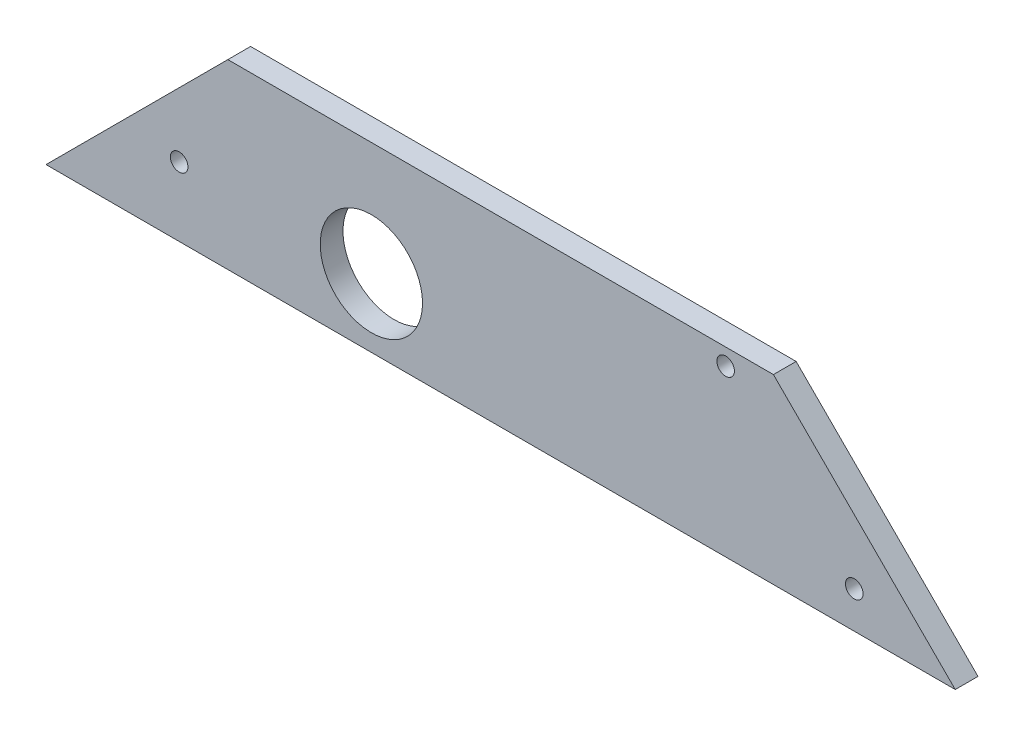
ISO-10303-21;
HEADER;
FILE_DESCRIPTION(('STEP AP214'),'2;1');
FILE_NAME('part.step','',(''),(''),'','','');
FILE_SCHEMA(('AUTOMOTIVE_DESIGN { 1 0 10303 214 1 1 1 1 }'));
ENDSEC;
DATA;
#1=APPLICATION_CONTEXT('core data for automotive mechanical design processes');
#2=APPLICATION_PROTOCOL_DEFINITION('international standard','automotive_design',2000,#1);
#3=PRODUCT_CONTEXT('',#1,'mechanical');
#4=PRODUCT('Part','Part','',(#3));
#5=PRODUCT_RELATED_PRODUCT_CATEGORY('part','',(#4));
#6=PRODUCT_DEFINITION_FORMATION('','',#4);
#7=PRODUCT_DEFINITION_CONTEXT('part definition',#1,'design');
#8=PRODUCT_DEFINITION('design','',#6,#7);
#9=PRODUCT_DEFINITION_SHAPE('','',#8);
#10=(LENGTH_UNIT() NAMED_UNIT(*) SI_UNIT(.MILLI.,.METRE.));
#11=(NAMED_UNIT(*) PLANE_ANGLE_UNIT() SI_UNIT($,.RADIAN.));
#12=(NAMED_UNIT(*) SI_UNIT($,.STERADIAN.) SOLID_ANGLE_UNIT());
#13=UNCERTAINTY_MEASURE_WITH_UNIT(LENGTH_MEASURE(1.E-05),#10,'distance_accuracy_value','');
#14=(GEOMETRIC_REPRESENTATION_CONTEXT(3) GLOBAL_UNCERTAINTY_ASSIGNED_CONTEXT((#13)) GLOBAL_UNIT_ASSIGNED_CONTEXT((#10,
#11,#12)) REPRESENTATION_CONTEXT('',''));
#15=CARTESIAN_POINT('',(0.,0.,0.));
#16=DIRECTION('',(0.,0.,1.));
#17=DIRECTION('',(1.,0.,0.));
#18=AXIS2_PLACEMENT_3D('',#15,#16,#17);
#19=CARTESIAN_POINT('',(-76.1999999999995,29.1621533831808,3.175));
#20=DIRECTION('',(0.,-1.,0.));
#21=DIRECTION('',(1.,0.,0.));
#22=AXIS2_PLACEMENT_3D('',#19,#20,#21);
#23=PLANE('',#22);
#24=DIRECTION('',(-1.,0.,0.));
#25=VECTOR('',#24,1.);
#26=CARTESIAN_POINT('',(-76.1999999999995,29.1621533831808,-3.175));
#27=LINE('',#26,#25);
#28=CARTESIAN_POINT('',(76.1999999999994,29.1621533831808,-3.175));
#29=VERTEX_POINT('',#28);
#30=CARTESIAN_POINT('',(-76.1999999999995,29.1621533831808,-3.175));
#31=VERTEX_POINT('',#30);
#32=EDGE_CURVE('E95',#29,#31,#27,.T.);
#33=ORIENTED_EDGE('',*,*,#32,.T.);
#34=DIRECTION('',(0.,0.,-1.));
#35=VECTOR('',#34,1.);
#36=CARTESIAN_POINT('',(-76.1999999999995,29.1621533831808,3.175));
#37=LINE('',#36,#35);
#38=CARTESIAN_POINT('',(-76.1999999999995,29.1621533831808,3.175));
#39=VERTEX_POINT('',#38);
#40=EDGE_CURVE('E11',#39,#31,#37,.T.);
#41=ORIENTED_EDGE('',*,*,#40,.F.);
#42=DIRECTION('',(-1.,0.,0.));
#43=VECTOR('',#42,1.);
#44=CARTESIAN_POINT('',(-76.1999999999995,29.1621533831808,3.175));
#45=LINE('',#44,#43);
#46=CARTESIAN_POINT('',(76.1999999999994,29.1621533831808,3.175));
#47=VERTEX_POINT('',#46);
#48=EDGE_CURVE('E83',#47,#39,#45,.T.);
#49=ORIENTED_EDGE('',*,*,#48,.F.);
#50=DIRECTION('',(0.,0.,-1.));
#51=VECTOR('',#50,1.);
#52=CARTESIAN_POINT('',(76.1999999999994,29.1621533831808,3.175));
#53=LINE('',#52,#51);
#54=EDGE_CURVE('E91',#47,#29,#53,.T.);
#55=ORIENTED_EDGE('',*,*,#54,.T.);
#56=EDGE_LOOP('',(#33,#41,#49,#55));
#57=FACE_BOUND('',#56,.T.);
#58=ADVANCED_FACE('F32',(#57),#23,.F.);
#59=CARTESIAN_POINT('',(-76.1999999999995,29.1621533831808,3.175));
#60=DIRECTION('',(0.707106781186544,-0.707106781186551,0.));
#61=DIRECTION('',(0.707106781186551,0.707106781186544,0.));
#62=AXIS2_PLACEMENT_3D('',#59,#60,#61);
#63=PLANE('',#62);
#64=DIRECTION('',(-0.707106781186551,-0.707106781186544,0.));
#65=VECTOR('',#64,1.);
#66=CARTESIAN_POINT('',(-76.1999999999995,29.1621533831808,-3.175));
#67=LINE('',#66,#65);
#68=CARTESIAN_POINT('',(-127.,-21.6378466168192,-3.175));
#69=VERTEX_POINT('',#68);
#70=EDGE_CURVE('E87',#31,#69,#67,.T.);
#71=ORIENTED_EDGE('',*,*,#70,.T.);
#72=DIRECTION('',(0.,0.,-1.));
#73=VECTOR('',#72,1.);
#74=CARTESIAN_POINT('',(-127.,-21.6378466168192,3.175));
#75=LINE('',#74,#73);
#76=CARTESIAN_POINT('',(-127.,-21.6378466168192,3.175));
#77=VERTEX_POINT('',#76);
#78=EDGE_CURVE('E40',#77,#69,#75,.T.);
#79=ORIENTED_EDGE('',*,*,#78,.F.);
#80=DIRECTION('',(-0.707106781186551,-0.707106781186544,0.));
#81=VECTOR('',#80,1.);
#82=CARTESIAN_POINT('',(-76.1999999999995,29.1621533831808,3.175));
#83=LINE('',#82,#81);
#84=EDGE_CURVE('E78',#39,#77,#83,.T.);
#85=ORIENTED_EDGE('',*,*,#84,.F.);
#86=ORIENTED_EDGE('',*,*,#40,.T.);
#87=EDGE_LOOP('',(#71,#79,#85,#86));
#88=FACE_BOUND('',#87,.T.);
#89=ADVANCED_FACE('F86',(#88),#63,.F.);
#90=CARTESIAN_POINT('',(-127.,-21.6378466168192,3.175));
#91=DIRECTION('',(0.,1.,0.));
#92=DIRECTION('',(0.,0.,1.));
#93=AXIS2_PLACEMENT_3D('',#90,#91,#92);
#94=PLANE('',#93);
#95=DIRECTION('',(1.,0.,0.));
#96=VECTOR('',#95,1.);
#97=CARTESIAN_POINT('',(-127.,-21.6378466168192,-3.175));
#98=LINE('',#97,#96);
#99=CARTESIAN_POINT('',(127.,-21.6378466168192,-3.175));
#100=VERTEX_POINT('',#99);
#101=EDGE_CURVE('E65',#69,#100,#98,.T.);
#102=ORIENTED_EDGE('',*,*,#101,.T.);
#103=DIRECTION('',(0.,0.,-1.));
#104=VECTOR('',#103,1.);
#105=CARTESIAN_POINT('',(127.,-21.6378466168192,3.175));
#106=LINE('',#105,#104);
#107=CARTESIAN_POINT('',(127.,-21.6378466168192,3.175));
#108=VERTEX_POINT('',#107);
#109=EDGE_CURVE('E88',#108,#100,#106,.T.);
#110=ORIENTED_EDGE('',*,*,#109,.F.);
#111=DIRECTION('',(1.,0.,0.));
#112=VECTOR('',#111,1.);
#113=CARTESIAN_POINT('',(-127.,-21.6378466168192,3.175));
#114=LINE('',#113,#112);
#115=EDGE_CURVE('E81',#77,#108,#114,.T.);
#116=ORIENTED_EDGE('',*,*,#115,.F.);
#117=ORIENTED_EDGE('',*,*,#78,.T.);
#118=EDGE_LOOP('',(#102,#110,#116,#117));
#119=FACE_BOUND('',#118,.T.);
#120=ADVANCED_FACE('F89',(#119),#94,.F.);
#121=CARTESIAN_POINT('',(127.,-21.6378466168192,3.175));
#122=DIRECTION('',(-0.707106781186543,-0.707106781186551,0.));
#123=DIRECTION('',(0.707106781186551,-0.707106781186544,0.));
#124=AXIS2_PLACEMENT_3D('',#121,#122,#123);
#125=PLANE('',#124);
#126=DIRECTION('',(-0.707106781186552,0.707106781186544,0.));
#127=VECTOR('',#126,1.);
#128=CARTESIAN_POINT('',(127.,-21.6378466168192,-3.175));
#129=LINE('',#128,#127);
#130=EDGE_CURVE('E71',#100,#29,#129,.T.);
#131=ORIENTED_EDGE('',*,*,#130,.T.);
#132=ORIENTED_EDGE('',*,*,#54,.F.);
#133=DIRECTION('',(-0.707106781186552,0.707106781186544,0.));
#134=VECTOR('',#133,1.);
#135=CARTESIAN_POINT('',(127.,-21.6378466168192,3.175));
#136=LINE('',#135,#134);
#137=EDGE_CURVE('E48',#108,#47,#136,.T.);
#138=ORIENTED_EDGE('',*,*,#137,.F.);
#139=ORIENTED_EDGE('',*,*,#109,.T.);
#140=EDGE_LOOP('',(#131,#132,#138,#139));
#141=FACE_BOUND('',#140,.T.);
#142=ADVANCED_FACE('F103',(#141),#125,.F.);
#143=CARTESIAN_POINT('',(0.,0.,3.175));
#144=DIRECTION('',(0.,0.,1.));
#145=DIRECTION('',(1.,0.,0.));
#146=AXIS2_PLACEMENT_3D('',#143,#144,#145);
#147=PLANE('',#146);
#148=CARTESIAN_POINT('',(62.8617928474841,24.5398482935579,3.175));
#149=DIRECTION('',(0.,0.,1.));
#150=DIRECTION('',(1.,0.,0.));
#151=AXIS2_PLACEMENT_3D('',#148,#149,#150);
#152=CIRCLE('',#151,2.45744999999999);
#153=CARTESIAN_POINT('',(65.319242847484,24.5398482935579,3.175));
#154=VERTEX_POINT('',#153);
#155=EDGE_CURVE('E129',#154,#154,#152,.T.);
#156=ORIENTED_EDGE('',*,*,#155,.F.);
#157=EDGE_LOOP('',(#156));
#158=FACE_BOUND('',#157,.T.);
#159=CARTESIAN_POINT('',(98.7828173317607,-11.3811761907187,3.175));
#160=DIRECTION('',(0.,0.,1.));
#161=DIRECTION('',(1.,0.,0.));
#162=AXIS2_PLACEMENT_3D('',#159,#160,#161);
#163=CIRCLE('',#162,2.45744999999999);
#164=CARTESIAN_POINT('',(101.240267331761,-11.3811761907187,3.175));
#165=VERTEX_POINT('',#164);
#166=EDGE_CURVE('E123',#165,#165,#163,.T.);
#167=ORIENTED_EDGE('',*,*,#166,.F.);
#168=EDGE_LOOP('',(#167));
#169=FACE_BOUND('',#168,.T.);
#170=CARTESIAN_POINT('',(-89.8025612106916,-2.40092006964952,3.175));
#171=DIRECTION('',(0.,0.,1.));
#172=DIRECTION('',(1.,0.,0.));
#173=AXIS2_PLACEMENT_3D('',#170,#171,#172);
#174=CIRCLE('',#173,2.45744999999999);
#175=CARTESIAN_POINT('',(-87.3451112106916,-2.40092006964952,3.175));
#176=VERTEX_POINT('',#175);
#177=EDGE_CURVE('E117',#176,#176,#174,.T.);
#178=ORIENTED_EDGE('',*,*,#177,.F.);
#179=EDGE_LOOP('',(#178));
#180=FACE_BOUND('',#179,.T.);
#181=CARTESIAN_POINT('',(-36.1079510314463,-2.58784661681916,3.175));
#182=DIRECTION('',(0.,0.,1.));
#183=DIRECTION('',(1.,0.,0.));
#184=AXIS2_PLACEMENT_3D('',#181,#182,#183);
#185=CIRCLE('',#184,14.2875);
#186=CARTESIAN_POINT('',(-21.8204510314463,-2.58784661681916,3.175));
#187=VERTEX_POINT('',#186);
#188=EDGE_CURVE('E109',#187,#187,#185,.T.);
#189=ORIENTED_EDGE('',*,*,#188,.F.);
#190=EDGE_LOOP('',(#189));
#191=FACE_BOUND('',#190,.T.);
#192=ORIENTED_EDGE('',*,*,#48,.T.);
#193=ORIENTED_EDGE('',*,*,#84,.T.);
#194=ORIENTED_EDGE('',*,*,#115,.T.);
#195=ORIENTED_EDGE('',*,*,#137,.T.);
#196=EDGE_LOOP('',(#192,#193,#194,#195));
#197=FACE_BOUND('',#196,.T.);
#198=ADVANCED_FACE('F79',(#158,#169,#180,#191,#197),#147,.T.);
#199=CARTESIAN_POINT('',(0.,0.,-3.175));
#200=DIRECTION('',(0.,0.,1.));
#201=DIRECTION('',(1.,0.,0.));
#202=AXIS2_PLACEMENT_3D('',#199,#200,#201);
#203=PLANE('',#202);
#204=CARTESIAN_POINT('',(62.8617928474841,24.5398482935579,-3.17499999999999));
#205=DIRECTION('',(0.,0.,1.));
#206=DIRECTION('',(1.,0.,0.));
#207=AXIS2_PLACEMENT_3D('',#204,#205,#206);
#208=CIRCLE('',#207,2.45744999999999);
#209=CARTESIAN_POINT('',(65.319242847484,24.5398482935579,-3.17499999999999));
#210=VERTEX_POINT('',#209);
#211=EDGE_CURVE('E126',#210,#210,#208,.T.);
#212=ORIENTED_EDGE('',*,*,#211,.T.);
#213=EDGE_LOOP('',(#212));
#214=FACE_BOUND('',#213,.T.);
#215=CARTESIAN_POINT('',(98.7828173317607,-11.3811761907187,-3.17499999999999));
#216=DIRECTION('',(0.,0.,1.));
#217=DIRECTION('',(1.,0.,0.));
#218=AXIS2_PLACEMENT_3D('',#215,#216,#217);
#219=CIRCLE('',#218,2.45744999999999);
#220=CARTESIAN_POINT('',(101.240267331761,-11.3811761907187,-3.17499999999999));
#221=VERTEX_POINT('',#220);
#222=EDGE_CURVE('E120',#221,#221,#219,.T.);
#223=ORIENTED_EDGE('',*,*,#222,.T.);
#224=EDGE_LOOP('',(#223));
#225=FACE_BOUND('',#224,.T.);
#226=CARTESIAN_POINT('',(-89.8025612106916,-2.40092006964952,-3.17499999999999));
#227=DIRECTION('',(0.,0.,1.));
#228=DIRECTION('',(1.,0.,0.));
#229=AXIS2_PLACEMENT_3D('',#226,#227,#228);
#230=CIRCLE('',#229,2.45744999999999);
#231=CARTESIAN_POINT('',(-87.3451112106916,-2.40092006964952,-3.17499999999999));
#232=VERTEX_POINT('',#231);
#233=EDGE_CURVE('E112',#232,#232,#230,.T.);
#234=ORIENTED_EDGE('',*,*,#233,.T.);
#235=EDGE_LOOP('',(#234));
#236=FACE_BOUND('',#235,.T.);
#237=CARTESIAN_POINT('',(-36.1079510314463,-2.58784661681916,-3.175));
#238=DIRECTION('',(0.,0.,1.));
#239=DIRECTION('',(1.,0.,0.));
#240=AXIS2_PLACEMENT_3D('',#237,#238,#239);
#241=CIRCLE('',#240,14.2875);
#242=CARTESIAN_POINT('',(-21.8204510314463,-2.58784661681916,-3.175));
#243=VERTEX_POINT('',#242);
#244=EDGE_CURVE('E98',#243,#243,#241,.T.);
#245=ORIENTED_EDGE('',*,*,#244,.T.);
#246=EDGE_LOOP('',(#245));
#247=FACE_BOUND('',#246,.T.);
#248=ORIENTED_EDGE('',*,*,#32,.F.);
#249=ORIENTED_EDGE('',*,*,#130,.F.);
#250=ORIENTED_EDGE('',*,*,#101,.F.);
#251=ORIENTED_EDGE('',*,*,#70,.F.);
#252=EDGE_LOOP('',(#248,#249,#250,#251));
#253=FACE_BOUND('',#252,.T.);
#254=ADVANCED_FACE('F106',(#214,#225,#236,#247,#253),#203,.F.);
#255=CARTESIAN_POINT('',(-36.1079510314463,-2.58784661681916,-3.175));
#256=DIRECTION('',(0.,0.,1.));
#257=DIRECTION('',(1.,0.,0.));
#258=AXIS2_PLACEMENT_3D('',#255,#256,#257);
#259=CYLINDRICAL_SURFACE('',#258,14.2875);
#260=ORIENTED_EDGE('',*,*,#244,.F.);
#261=EDGE_LOOP('',(#260));
#262=FACE_BOUND('',#261,.T.);
#263=ORIENTED_EDGE('',*,*,#188,.T.);
#264=EDGE_LOOP('',(#263));
#265=FACE_BOUND('',#264,.T.);
#266=ADVANCED_FACE('F144',(#262,#265),#259,.F.);
#267=CARTESIAN_POINT('',(-89.8025612106916,-2.40092006964952,3.175));
#268=DIRECTION('',(0.,0.,1.));
#269=DIRECTION('',(1.,0.,0.));
#270=AXIS2_PLACEMENT_3D('',#267,#268,#269);
#271=CYLINDRICAL_SURFACE('',#270,2.45744999999999);
#272=ORIENTED_EDGE('',*,*,#233,.F.);
#273=EDGE_LOOP('',(#272));
#274=FACE_BOUND('',#273,.T.);
#275=ORIENTED_EDGE('',*,*,#177,.T.);
#276=EDGE_LOOP('',(#275));
#277=FACE_BOUND('',#276,.T.);
#278=ADVANCED_FACE('F146',(#274,#277),#271,.F.);
#279=CARTESIAN_POINT('',(98.7828173317607,-11.3811761907187,3.175));
#280=DIRECTION('',(0.,0.,1.));
#281=DIRECTION('',(1.,0.,0.));
#282=AXIS2_PLACEMENT_3D('',#279,#280,#281);
#283=CYLINDRICAL_SURFACE('',#282,2.45744999999999);
#284=ORIENTED_EDGE('',*,*,#222,.F.);
#285=EDGE_LOOP('',(#284));
#286=FACE_BOUND('',#285,.T.);
#287=ORIENTED_EDGE('',*,*,#166,.T.);
#288=EDGE_LOOP('',(#287));
#289=FACE_BOUND('',#288,.T.);
#290=ADVANCED_FACE('F153',(#286,#289),#283,.F.);
#291=CARTESIAN_POINT('',(62.8617928474841,24.5398482935579,3.175));
#292=DIRECTION('',(0.,0.,1.));
#293=DIRECTION('',(1.,0.,0.));
#294=AXIS2_PLACEMENT_3D('',#291,#292,#293);
#295=CYLINDRICAL_SURFACE('',#294,2.45744999999999);
#296=ORIENTED_EDGE('',*,*,#211,.F.);
#297=EDGE_LOOP('',(#296));
#298=FACE_BOUND('',#297,.T.);
#299=ORIENTED_EDGE('',*,*,#155,.T.);
#300=EDGE_LOOP('',(#299));
#301=FACE_BOUND('',#300,.T.);
#302=ADVANCED_FACE('F133',(#298,#301),#295,.F.);
#303=CLOSED_SHELL('',(#58,#89,#120,#142,#198,#254,#266,#278,#290,#302));
#304=MANIFOLD_SOLID_BREP('B2',#303);
#305=ADVANCED_BREP_SHAPE_REPRESENTATION('',(#18,#304),#14);
#306=SHAPE_DEFINITION_REPRESENTATION(#9,#305);
ENDSEC;
END-ISO-10303-21;
